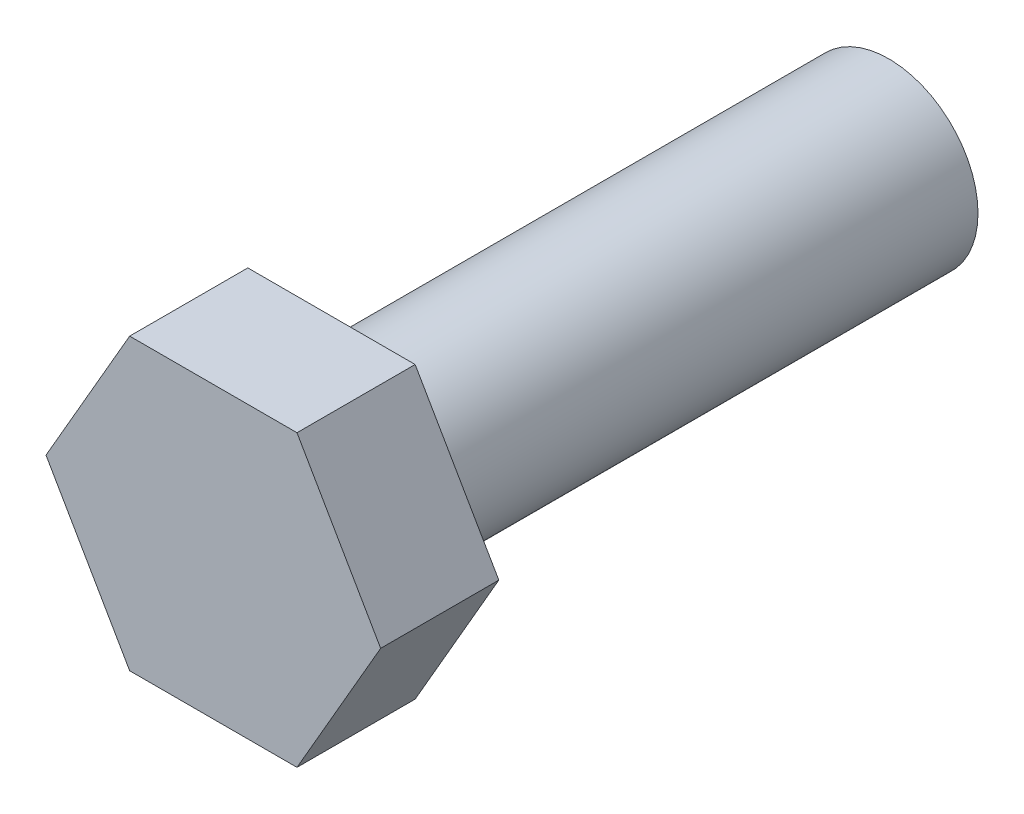
ISO-10303-21;
HEADER;
FILE_DESCRIPTION(('STEP AP214'),'2;1');
FILE_NAME('part.step','',(''),(''),'','','');
FILE_SCHEMA(('AUTOMOTIVE_DESIGN { 1 0 10303 214 1 1 1 1 }'));
ENDSEC;
DATA;
#1=APPLICATION_CONTEXT('core data for automotive mechanical design processes');
#2=APPLICATION_PROTOCOL_DEFINITION('international standard','automotive_design',2000,#1);
#3=PRODUCT_CONTEXT('',#1,'mechanical');
#4=PRODUCT('Part','Part','',(#3));
#5=PRODUCT_RELATED_PRODUCT_CATEGORY('part','',(#4));
#6=PRODUCT_DEFINITION_FORMATION('','',#4);
#7=PRODUCT_DEFINITION_CONTEXT('part definition',#1,'design');
#8=PRODUCT_DEFINITION('design','',#6,#7);
#9=PRODUCT_DEFINITION_SHAPE('','',#8);
#10=(LENGTH_UNIT() NAMED_UNIT(*) SI_UNIT(.MILLI.,.METRE.));
#11=(NAMED_UNIT(*) PLANE_ANGLE_UNIT() SI_UNIT($,.RADIAN.));
#12=(NAMED_UNIT(*) SI_UNIT($,.STERADIAN.) SOLID_ANGLE_UNIT());
#13=UNCERTAINTY_MEASURE_WITH_UNIT(LENGTH_MEASURE(1.E-05),#10,'distance_accuracy_value','');
#14=(GEOMETRIC_REPRESENTATION_CONTEXT(3) GLOBAL_UNCERTAINTY_ASSIGNED_CONTEXT((#13)) GLOBAL_UNIT_ASSIGNED_CONTEXT((#10,
#11,#12)) REPRESENTATION_CONTEXT('',''));
#15=CARTESIAN_POINT('',(0.,0.,0.));
#16=DIRECTION('',(0.,0.,1.));
#17=DIRECTION('',(1.,0.,0.));
#18=AXIS2_PLACEMENT_3D('',#15,#16,#17);
#19=CARTESIAN_POINT('',(0.,0.,-25.));
#20=DIRECTION('',(0.,0.,1.));
#21=DIRECTION('',(1.,0.,0.));
#22=AXIS2_PLACEMENT_3D('',#19,#20,#21);
#23=CYLINDRICAL_SURFACE('',#22,4.);
#24=CARTESIAN_POINT('',(0.,0.,-25.));
#25=DIRECTION('',(0.,0.,1.));
#26=DIRECTION('',(1.,0.,0.));
#27=AXIS2_PLACEMENT_3D('',#24,#25,#26);
#28=CIRCLE('',#27,4.);
#29=CARTESIAN_POINT('',(4.,0.,-25.));
#30=VERTEX_POINT('',#29);
#31=EDGE_CURVE('E11',#30,#30,#28,.T.);
#32=ORIENTED_EDGE('',*,*,#31,.T.);
#33=EDGE_LOOP('',(#32));
#34=FACE_BOUND('',#33,.T.);
#35=CARTESIAN_POINT('',(0.,0.,0.));
#36=DIRECTION('',(0.,0.,1.));
#37=DIRECTION('',(1.,0.,0.));
#38=AXIS2_PLACEMENT_3D('',#35,#36,#37);
#39=CIRCLE('',#38,4.);
#40=CARTESIAN_POINT('',(4.,0.,0.));
#41=VERTEX_POINT('',#40);
#42=EDGE_CURVE('E40',#41,#41,#39,.T.);
#43=ORIENTED_EDGE('',*,*,#42,.F.);
#44=EDGE_LOOP('',(#43));
#45=FACE_BOUND('',#44,.T.);
#46=ADVANCED_FACE('F37',(#34,#45),#23,.T.);
#47=CARTESIAN_POINT('',(0.,0.,-25.));
#48=DIRECTION('',(0.,0.,1.));
#49=DIRECTION('',(1.,0.,0.));
#50=AXIS2_PLACEMENT_3D('',#47,#48,#49);
#51=PLANE('',#50);
#52=ORIENTED_EDGE('',*,*,#31,.F.);
#53=EDGE_LOOP('',(#52));
#54=FACE_BOUND('',#53,.T.);
#55=ADVANCED_FACE('F148',(#54),#51,.F.);
#56=CARTESIAN_POINT('',(3.75277674973257,6.5,5.3));
#57=DIRECTION('',(0.,-1.,0.));
#58=DIRECTION('',(0.,0.,-1.));
#59=AXIS2_PLACEMENT_3D('',#56,#57,#58);
#60=PLANE('',#59);
#61=DIRECTION('',(-1.,0.,0.));
#62=VECTOR('',#61,1.);
#63=CARTESIAN_POINT('',(3.75277674973257,6.5,0.));
#64=LINE('',#63,#62);
#65=CARTESIAN_POINT('',(3.75277674973257,6.5,0.));
#66=VERTEX_POINT('',#65);
#67=CARTESIAN_POINT('',(-3.75277674973257,6.5,0.));
#68=VERTEX_POINT('',#67);
#69=EDGE_CURVE('E122',#66,#68,#64,.T.);
#70=ORIENTED_EDGE('',*,*,#69,.T.);
#71=DIRECTION('',(0.,0.,-1.));
#72=VECTOR('',#71,1.);
#73=CARTESIAN_POINT('',(-3.75277674973257,6.5,5.3));
#74=LINE('',#73,#72);
#75=CARTESIAN_POINT('',(-3.75277674973257,6.5,5.3));
#76=VERTEX_POINT('',#75);
#77=EDGE_CURVE('E139',#76,#68,#74,.T.);
#78=ORIENTED_EDGE('',*,*,#77,.F.);
#79=DIRECTION('',(-1.,0.,0.));
#80=VECTOR('',#79,1.);
#81=CARTESIAN_POINT('',(3.75277674973257,6.5,5.3));
#82=LINE('',#81,#80);
#83=CARTESIAN_POINT('',(3.75277674973257,6.5,5.3));
#84=VERTEX_POINT('',#83);
#85=EDGE_CURVE('E132',#84,#76,#82,.T.);
#86=ORIENTED_EDGE('',*,*,#85,.F.);
#87=DIRECTION('',(0.,0.,-1.));
#88=VECTOR('',#87,1.);
#89=CARTESIAN_POINT('',(3.75277674973257,6.5,5.3));
#90=LINE('',#89,#88);
#91=EDGE_CURVE('E118',#84,#66,#90,.T.);
#92=ORIENTED_EDGE('',*,*,#91,.T.);
#93=EDGE_LOOP('',(#70,#78,#86,#92));
#94=FACE_BOUND('',#93,.T.);
#95=ADVANCED_FACE('F153',(#94),#60,.F.);
#96=CARTESIAN_POINT('',(-3.75277674973257,6.5,5.3));
#97=DIRECTION('',(0.866025403784439,-0.5,0.));
#98=DIRECTION('',(0.5,0.866025403784439,0.));
#99=AXIS2_PLACEMENT_3D('',#96,#97,#98);
#100=PLANE('',#99);
#101=DIRECTION('',(-0.5,-0.866025403784439,0.));
#102=VECTOR('',#101,1.);
#103=CARTESIAN_POINT('',(-3.75277674973257,6.5,0.));
#104=LINE('',#103,#102);
#105=CARTESIAN_POINT('',(-7.50555349946514,0.,0.));
#106=VERTEX_POINT('',#105);
#107=EDGE_CURVE('E125',#68,#106,#104,.T.);
#108=ORIENTED_EDGE('',*,*,#107,.T.);
#109=DIRECTION('',(0.,0.,-1.));
#110=VECTOR('',#109,1.);
#111=CARTESIAN_POINT('',(-7.50555349946514,0.,5.3));
#112=LINE('',#111,#110);
#113=CARTESIAN_POINT('',(-7.50555349946514,0.,5.3));
#114=VERTEX_POINT('',#113);
#115=EDGE_CURVE('E136',#114,#106,#112,.T.);
#116=ORIENTED_EDGE('',*,*,#115,.F.);
#117=DIRECTION('',(-0.5,-0.866025403784439,0.));
#118=VECTOR('',#117,1.);
#119=CARTESIAN_POINT('',(-3.75277674973257,6.5,5.3));
#120=LINE('',#119,#118);
#121=EDGE_CURVE('E91',#76,#114,#120,.T.);
#122=ORIENTED_EDGE('',*,*,#121,.F.);
#123=ORIENTED_EDGE('',*,*,#77,.T.);
#124=EDGE_LOOP('',(#108,#116,#122,#123));
#125=FACE_BOUND('',#124,.T.);
#126=ADVANCED_FACE('F159',(#125),#100,.F.);
#127=CARTESIAN_POINT('',(-7.50555349946514,0.,5.3));
#128=DIRECTION('',(0.866025403784439,0.5,0.));
#129=DIRECTION('',(-0.5,0.866025403784439,0.));
#130=AXIS2_PLACEMENT_3D('',#127,#128,#129);
#131=PLANE('',#130);
#132=DIRECTION('',(0.5,-0.866025403784439,0.));
#133=VECTOR('',#132,1.);
#134=CARTESIAN_POINT('',(-7.50555349946514,0.,0.));
#135=LINE('',#134,#133);
#136=CARTESIAN_POINT('',(-3.75277674973257,-6.5,0.));
#137=VERTEX_POINT('',#136);
#138=EDGE_CURVE('E127',#106,#137,#135,.T.);
#139=ORIENTED_EDGE('',*,*,#138,.T.);
#140=DIRECTION('',(0.,0.,-1.));
#141=VECTOR('',#140,1.);
#142=CARTESIAN_POINT('',(-3.75277674973257,-6.5,5.3));
#143=LINE('',#142,#141);
#144=CARTESIAN_POINT('',(-3.75277674973257,-6.5,5.3));
#145=VERTEX_POINT('',#144);
#146=EDGE_CURVE('E113',#145,#137,#143,.T.);
#147=ORIENTED_EDGE('',*,*,#146,.F.);
#148=DIRECTION('',(0.5,-0.866025403784439,0.));
#149=VECTOR('',#148,1.);
#150=CARTESIAN_POINT('',(-7.50555349946514,0.,5.3));
#151=LINE('',#150,#149);
#152=EDGE_CURVE('E104',#114,#145,#151,.T.);
#153=ORIENTED_EDGE('',*,*,#152,.F.);
#154=ORIENTED_EDGE('',*,*,#115,.T.);
#155=EDGE_LOOP('',(#139,#147,#153,#154));
#156=FACE_BOUND('',#155,.T.);
#157=ADVANCED_FACE('F165',(#156),#131,.F.);
#158=CARTESIAN_POINT('',(-3.75277674973257,-6.5,5.3));
#159=DIRECTION('',(0.,1.,0.));
#160=DIRECTION('',(-1.,0.,0.));
#161=AXIS2_PLACEMENT_3D('',#158,#159,#160);
#162=PLANE('',#161);
#163=DIRECTION('',(1.,0.,0.));
#164=VECTOR('',#163,1.);
#165=CARTESIAN_POINT('',(-3.75277674973257,-6.5,0.));
#166=LINE('',#165,#164);
#167=CARTESIAN_POINT('',(3.75277674973257,-6.5,0.));
#168=VERTEX_POINT('',#167);
#169=EDGE_CURVE('E112',#137,#168,#166,.T.);
#170=ORIENTED_EDGE('',*,*,#169,.T.);
#171=DIRECTION('',(0.,0.,-1.));
#172=VECTOR('',#171,1.);
#173=CARTESIAN_POINT('',(3.75277674973257,-6.5,5.3));
#174=LINE('',#173,#172);
#175=CARTESIAN_POINT('',(3.75277674973257,-6.5,5.3));
#176=VERTEX_POINT('',#175);
#177=EDGE_CURVE('E109',#176,#168,#174,.T.);
#178=ORIENTED_EDGE('',*,*,#177,.F.);
#179=DIRECTION('',(1.,0.,0.));
#180=VECTOR('',#179,1.);
#181=CARTESIAN_POINT('',(-3.75277674973257,-6.5,5.3));
#182=LINE('',#181,#180);
#183=EDGE_CURVE('E98',#145,#176,#182,.T.);
#184=ORIENTED_EDGE('',*,*,#183,.F.);
#185=ORIENTED_EDGE('',*,*,#146,.T.);
#186=EDGE_LOOP('',(#170,#178,#184,#185));
#187=FACE_BOUND('',#186,.T.);
#188=ADVANCED_FACE('F110',(#187),#162,.F.);
#189=CARTESIAN_POINT('',(3.75277674973257,-6.5,5.3));
#190=DIRECTION('',(-0.866025403784439,0.5,0.));
#191=DIRECTION('',(-0.5,-0.866025403784439,0.));
#192=AXIS2_PLACEMENT_3D('',#189,#190,#191);
#193=PLANE('',#192);
#194=DIRECTION('',(0.5,0.866025403784439,0.));
#195=VECTOR('',#194,1.);
#196=CARTESIAN_POINT('',(3.75277674973257,-6.5,0.));
#197=LINE('',#196,#195);
#198=CARTESIAN_POINT('',(7.50555349946513,0.,0.));
#199=VERTEX_POINT('',#198);
#200=EDGE_CURVE('E76',#168,#199,#197,.T.);
#201=ORIENTED_EDGE('',*,*,#200,.T.);
#202=DIRECTION('',(0.,0.,-1.));
#203=VECTOR('',#202,1.);
#204=CARTESIAN_POINT('',(7.50555349946513,0.,5.3));
#205=LINE('',#204,#203);
#206=CARTESIAN_POINT('',(7.50555349946513,0.,5.3));
#207=VERTEX_POINT('',#206);
#208=EDGE_CURVE('E114',#207,#199,#205,.T.);
#209=ORIENTED_EDGE('',*,*,#208,.F.);
#210=DIRECTION('',(0.5,0.866025403784439,0.));
#211=VECTOR('',#210,1.);
#212=CARTESIAN_POINT('',(3.75277674973257,-6.5,5.3));
#213=LINE('',#212,#211);
#214=EDGE_CURVE('E102',#176,#207,#213,.T.);
#215=ORIENTED_EDGE('',*,*,#214,.F.);
#216=ORIENTED_EDGE('',*,*,#177,.T.);
#217=EDGE_LOOP('',(#201,#209,#215,#216));
#218=FACE_BOUND('',#217,.T.);
#219=ADVANCED_FACE('F116',(#218),#193,.F.);
#220=CARTESIAN_POINT('',(7.50555349946513,0.,5.3));
#221=DIRECTION('',(-0.866025403784439,-0.5,0.));
#222=DIRECTION('',(0.5,-0.866025403784439,0.));
#223=AXIS2_PLACEMENT_3D('',#220,#221,#222);
#224=PLANE('',#223);
#225=DIRECTION('',(-0.5,0.866025403784439,0.));
#226=VECTOR('',#225,1.);
#227=CARTESIAN_POINT('',(7.50555349946513,0.,0.));
#228=LINE('',#227,#226);
#229=EDGE_CURVE('E82',#199,#66,#228,.T.);
#230=ORIENTED_EDGE('',*,*,#229,.T.);
#231=ORIENTED_EDGE('',*,*,#91,.F.);
#232=DIRECTION('',(-0.5,0.866025403784439,0.));
#233=VECTOR('',#232,1.);
#234=CARTESIAN_POINT('',(7.50555349946513,0.,5.3));
#235=LINE('',#234,#233);
#236=EDGE_CURVE('E53',#207,#84,#235,.T.);
#237=ORIENTED_EDGE('',*,*,#236,.F.);
#238=ORIENTED_EDGE('',*,*,#208,.T.);
#239=EDGE_LOOP('',(#230,#231,#237,#238));
#240=FACE_BOUND('',#239,.T.);
#241=ADVANCED_FACE('F173',(#240),#224,.F.);
#242=CARTESIAN_POINT('',(-11.2583302491977,6.5,5.3));
#243=DIRECTION('',(0.,0.,1.));
#244=DIRECTION('',(1.,0.,0.));
#245=AXIS2_PLACEMENT_3D('',#242,#243,#244);
#246=PLANE('',#245);
#247=ORIENTED_EDGE('',*,*,#85,.T.);
#248=ORIENTED_EDGE('',*,*,#121,.T.);
#249=ORIENTED_EDGE('',*,*,#152,.T.);
#250=ORIENTED_EDGE('',*,*,#183,.T.);
#251=ORIENTED_EDGE('',*,*,#214,.T.);
#252=ORIENTED_EDGE('',*,*,#236,.T.);
#253=EDGE_LOOP('',(#247,#248,#249,#250,#251,#252));
#254=FACE_BOUND('',#253,.T.);
#255=ADVANCED_FACE('F100',(#254),#246,.T.);
#256=CARTESIAN_POINT('',(-11.2583302491977,6.5,0.));
#257=DIRECTION('',(0.,0.,1.));
#258=DIRECTION('',(1.,0.,0.));
#259=AXIS2_PLACEMENT_3D('',#256,#257,#258);
#260=PLANE('',#259);
#261=ORIENTED_EDGE('',*,*,#42,.T.);
#262=EDGE_LOOP('',(#261));
#263=FACE_BOUND('',#262,.T.);
#264=ORIENTED_EDGE('',*,*,#69,.F.);
#265=ORIENTED_EDGE('',*,*,#229,.F.);
#266=ORIENTED_EDGE('',*,*,#200,.F.);
#267=ORIENTED_EDGE('',*,*,#169,.F.);
#268=ORIENTED_EDGE('',*,*,#138,.F.);
#269=ORIENTED_EDGE('',*,*,#107,.F.);
#270=EDGE_LOOP('',(#264,#265,#266,#267,#268,#269));
#271=FACE_BOUND('',#270,.T.);
#272=ADVANCED_FACE('F144',(#263,#271),#260,.F.);
#273=CLOSED_SHELL('',(#46,#55,#95,#126,#157,#188,#219,#241,#255,#272));
#274=MANIFOLD_SOLID_BREP('B2',#273);
#275=ADVANCED_BREP_SHAPE_REPRESENTATION('',(#18,#274),#14);
#276=SHAPE_DEFINITION_REPRESENTATION(#9,#275);
ENDSEC;
END-ISO-10303-21;
